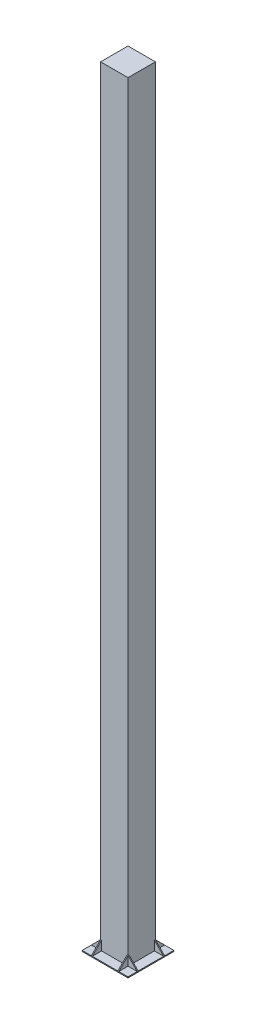
ISO-10303-21;
HEADER;
FILE_DESCRIPTION(('STEP AP214'),'2;1');
FILE_NAME('part.step','',(''),(''),'','','');
FILE_SCHEMA(('AUTOMOTIVE_DESIGN { 1 0 10303 214 1 1 1 1 }'));
ENDSEC;
DATA;
#1=APPLICATION_CONTEXT('core data for automotive mechanical design processes');
#2=APPLICATION_PROTOCOL_DEFINITION('international standard','automotive_design',2000,#1);
#3=PRODUCT_CONTEXT('',#1,'mechanical');
#4=PRODUCT('Part','Part','',(#3));
#5=PRODUCT_RELATED_PRODUCT_CATEGORY('part','',(#4));
#6=PRODUCT_DEFINITION_FORMATION('','',#4);
#7=PRODUCT_DEFINITION_CONTEXT('part definition',#1,'design');
#8=PRODUCT_DEFINITION('design','',#6,#7);
#9=PRODUCT_DEFINITION_SHAPE('','',#8);
#10=(LENGTH_UNIT() NAMED_UNIT(*) SI_UNIT(.MILLI.,.METRE.));
#11=(NAMED_UNIT(*) PLANE_ANGLE_UNIT() SI_UNIT($,.RADIAN.));
#12=(NAMED_UNIT(*) SI_UNIT($,.STERADIAN.) SOLID_ANGLE_UNIT());
#13=UNCERTAINTY_MEASURE_WITH_UNIT(LENGTH_MEASURE(1.E-05),#10,'distance_accuracy_value','');
#14=(GEOMETRIC_REPRESENTATION_CONTEXT(3) GLOBAL_UNCERTAINTY_ASSIGNED_CONTEXT((#13)) GLOBAL_UNIT_ASSIGNED_CONTEXT((#10,
#11,#12)) REPRESENTATION_CONTEXT('',''));
#15=CARTESIAN_POINT('',(0.,0.,0.));
#16=DIRECTION('',(0.,0.,1.));
#17=DIRECTION('',(1.,0.,0.));
#18=AXIS2_PLACEMENT_3D('',#15,#16,#17);
#19=CARTESIAN_POINT('',(0.,12.7,0.));
#20=DIRECTION('',(0.,1.,0.));
#21=DIRECTION('',(0.,0.,1.));
#22=AXIS2_PLACEMENT_3D('',#19,#20,#21);
#23=PLANE('',#22);
#24=DIRECTION('',(0.,0.,-1.));
#25=VECTOR('',#24,1.);
#26=CARTESIAN_POINT('',(-297.8,12.7,297.8));
#27=LINE('',#26,#25);
#28=CARTESIAN_POINT('',(-297.8,12.7,165.1));
#29=VERTEX_POINT('',#28);
#30=CARTESIAN_POINT('',(-297.8,12.7,-165.1));
#31=VERTEX_POINT('',#30);
#32=EDGE_CURVE('E223',#29,#31,#27,.T.);
#33=ORIENTED_EDGE('',*,*,#32,.F.);
#34=DIRECTION('',(1.,0.,0.));
#35=VECTOR('',#34,1.);
#36=CARTESIAN_POINT('',(-177.8,12.7,165.1));
#37=LINE('',#36,#35);
#38=CARTESIAN_POINT('',(-177.8,12.7,165.1));
#39=VERTEX_POINT('',#38);
#40=EDGE_CURVE('E213',#29,#39,#37,.T.);
#41=ORIENTED_EDGE('',*,*,#40,.T.);
#42=DIRECTION('',(0.,0.,1.));
#43=VECTOR('',#42,1.);
#44=CARTESIAN_POINT('',(-177.8,12.7000000000006,177.8));
#45=LINE('',#44,#43);
#46=CARTESIAN_POINT('',(-177.8,12.7,-165.1));
#47=VERTEX_POINT('',#46);
#48=EDGE_CURVE('E222',#47,#39,#45,.T.);
#49=ORIENTED_EDGE('',*,*,#48,.F.);
#50=DIRECTION('',(-1.,0.,0.));
#51=VECTOR('',#50,1.);
#52=CARTESIAN_POINT('',(-177.8,12.7,-165.1));
#53=LINE('',#52,#51);
#54=EDGE_CURVE('E415',#47,#31,#53,.T.);
#55=ORIENTED_EDGE('',*,*,#54,.T.);
#56=EDGE_LOOP('',(#33,#41,#49,#55));
#57=FACE_BOUND('',#56,.T.);
#58=ADVANCED_FACE('F37',(#57),#23,.T.);
#59=CARTESIAN_POINT('',(-177.8,10000.,177.8));
#60=DIRECTION('',(1.,0.,0.));
#61=DIRECTION('',(0.,0.,-1.));
#62=AXIS2_PLACEMENT_3D('',#59,#60,#61);
#63=PLANE('',#62);
#64=DIRECTION('',(0.,1.,0.));
#65=VECTOR('',#64,1.);
#66=CARTESIAN_POINT('',(-177.8,132.700000000008,165.1));
#67=LINE('',#66,#65);
#68=CARTESIAN_POINT('',(-177.8,132.700000000008,165.1));
#69=VERTEX_POINT('',#68);
#70=EDGE_CURVE('E210',#39,#69,#67,.T.);
#71=ORIENTED_EDGE('',*,*,#70,.T.);
#72=DIRECTION('',(0.,0.,1.));
#73=VECTOR('',#72,1.);
#74=CARTESIAN_POINT('',(-177.8,132.700000000008,165.1));
#75=LINE('',#74,#73);
#76=CARTESIAN_POINT('',(-177.8,132.700000000008,177.8));
#77=VERTEX_POINT('',#76);
#78=EDGE_CURVE('E413',#69,#77,#75,.T.);
#79=ORIENTED_EDGE('',*,*,#78,.T.);
#80=DIRECTION('',(0.,-1.,0.));
#81=VECTOR('',#80,1.);
#82=CARTESIAN_POINT('',(-177.8,10000.,177.8));
#83=LINE('',#82,#81);
#84=CARTESIAN_POINT('',(-177.8,10000.,177.8));
#85=VERTEX_POINT('',#84);
#86=EDGE_CURVE('E259',#85,#77,#83,.T.);
#87=ORIENTED_EDGE('',*,*,#86,.F.);
#88=DIRECTION('',(0.,0.,1.));
#89=VECTOR('',#88,1.);
#90=CARTESIAN_POINT('',(-177.8,10000.,177.8));
#91=LINE('',#90,#89);
#92=CARTESIAN_POINT('',(-177.8,10000.,-177.8));
#93=VERTEX_POINT('',#92);
#94=EDGE_CURVE('E252',#93,#85,#91,.T.);
#95=ORIENTED_EDGE('',*,*,#94,.F.);
#96=DIRECTION('',(0.,-1.,0.));
#97=VECTOR('',#96,1.);
#98=CARTESIAN_POINT('',(-177.8,10000.,-177.8));
#99=LINE('',#98,#97);
#100=CARTESIAN_POINT('',(-177.8,132.700000000008,-177.8));
#101=VERTEX_POINT('',#100);
#102=EDGE_CURVE('E262',#93,#101,#99,.T.);
#103=ORIENTED_EDGE('',*,*,#102,.T.);
#104=DIRECTION('',(0.,0.,-1.));
#105=VECTOR('',#104,1.);
#106=CARTESIAN_POINT('',(-177.8,132.700000000008,-165.1));
#107=LINE('',#106,#105);
#108=CARTESIAN_POINT('',(-177.8,132.700000000008,-165.1));
#109=VERTEX_POINT('',#108);
#110=EDGE_CURVE('E426',#109,#101,#107,.T.);
#111=ORIENTED_EDGE('',*,*,#110,.F.);
#112=DIRECTION('',(0.,-1.,0.));
#113=VECTOR('',#112,1.);
#114=CARTESIAN_POINT('',(-177.8,132.700000000008,-165.1));
#115=LINE('',#114,#113);
#116=EDGE_CURVE('E231',#109,#47,#115,.T.);
#117=ORIENTED_EDGE('',*,*,#116,.T.);
#118=ORIENTED_EDGE('',*,*,#48,.T.);
#119=EDGE_LOOP('',(#71,#79,#87,#95,#103,#111,#117,#118));
#120=FACE_BOUND('',#119,.T.);
#121=ADVANCED_FACE('F228',(#120),#63,.F.);
#122=CARTESIAN_POINT('',(-297.8,12.7,-177.8));
#123=VERTEX_POINT('',#122);
#124=CARTESIAN_POINT('',(-297.8,12.7,-297.8));
#125=VERTEX_POINT('',#124);
#126=EDGE_CURVE('E355',#123,#125,#27,.T.);
#127=ORIENTED_EDGE('',*,*,#126,.F.);
#128=DIRECTION('',(-1.,0.,0.));
#129=VECTOR('',#128,1.);
#130=CARTESIAN_POINT('',(-177.8,12.7,-177.8));
#131=LINE('',#130,#129);
#132=CARTESIAN_POINT('',(-177.8,12.7,-177.8));
#133=VERTEX_POINT('',#132);
#134=EDGE_CURVE('E60',#133,#123,#131,.T.);
#135=ORIENTED_EDGE('',*,*,#134,.F.);
#136=CARTESIAN_POINT('',(-177.8,12.7,-297.8));
#137=VERTEX_POINT('',#136);
#138=EDGE_CURVE('E232',#137,#133,#45,.T.);
#139=ORIENTED_EDGE('',*,*,#138,.F.);
#140=DIRECTION('',(1.,0.,0.));
#141=VECTOR('',#140,1.);
#142=CARTESIAN_POINT('',(297.8,12.7,-297.8));
#143=LINE('',#142,#141);
#144=EDGE_CURVE('E301',#125,#137,#143,.T.);
#145=ORIENTED_EDGE('',*,*,#144,.F.);
#146=EDGE_LOOP('',(#127,#135,#139,#145));
#147=FACE_BOUND('',#146,.T.);
#148=ADVANCED_FACE('F533',(#147),#23,.T.);
#149=DIRECTION('',(0.,-1.,0.));
#150=VECTOR('',#149,1.);
#151=CARTESIAN_POINT('',(-177.8,132.700000000008,-177.8));
#152=LINE('',#151,#150);
#153=EDGE_CURVE('E418',#101,#133,#152,.T.);
#154=ORIENTED_EDGE('',*,*,#153,.F.);
#155=DIRECTION('',(0.,-0.707106781186563,-0.707106781186532));
#156=VECTOR('',#155,1.);
#157=CARTESIAN_POINT('',(-177.8,12.7,-297.8));
#158=LINE('',#157,#156);
#159=EDGE_CURVE('E331',#101,#137,#158,.T.);
#160=ORIENTED_EDGE('',*,*,#159,.T.);
#161=ORIENTED_EDGE('',*,*,#138,.T.);
#162=EDGE_LOOP('',(#154,#160,#161));
#163=FACE_BOUND('',#162,.T.);
#164=ADVANCED_FACE('F539',(#163),#63,.F.);
#165=DIRECTION('',(1.,0.,0.));
#166=VECTOR('',#165,1.);
#167=CARTESIAN_POINT('',(-177.8,12.7000000000006,177.8));
#168=LINE('',#167,#166);
#169=CARTESIAN_POINT('',(177.8,12.7,177.8));
#170=VERTEX_POINT('',#169);
#171=CARTESIAN_POINT('',(297.8,12.7,177.8));
#172=VERTEX_POINT('',#171);
#173=EDGE_CURVE('E45',#170,#172,#168,.T.);
#174=ORIENTED_EDGE('',*,*,#173,.F.);
#175=DIRECTION('',(0.,0.,-1.));
#176=VECTOR('',#175,1.);
#177=CARTESIAN_POINT('',(177.8,12.7,297.8));
#178=LINE('',#177,#176);
#179=CARTESIAN_POINT('',(177.8,12.7,297.8));
#180=VERTEX_POINT('',#179);
#181=EDGE_CURVE('E433',#180,#170,#178,.T.);
#182=ORIENTED_EDGE('',*,*,#181,.F.);
#183=DIRECTION('',(-1.,0.,0.));
#184=VECTOR('',#183,1.);
#185=CARTESIAN_POINT('',(297.8,12.7,297.8));
#186=LINE('',#185,#184);
#187=CARTESIAN_POINT('',(297.8,12.7,297.8));
#188=VERTEX_POINT('',#187);
#189=EDGE_CURVE('E297',#188,#180,#186,.T.);
#190=ORIENTED_EDGE('',*,*,#189,.F.);
#191=DIRECTION('',(0.,0.,1.));
#192=VECTOR('',#191,1.);
#193=CARTESIAN_POINT('',(297.8,12.7,297.8));
#194=LINE('',#193,#192);
#195=EDGE_CURVE('E294',#172,#188,#194,.T.);
#196=ORIENTED_EDGE('',*,*,#195,.F.);
#197=EDGE_LOOP('',(#174,#182,#190,#196));
#198=FACE_BOUND('',#197,.T.);
#199=ADVANCED_FACE('F295',(#198),#23,.T.);
#200=CARTESIAN_POINT('',(-177.8,10000.,177.8));
#201=DIRECTION('',(0.,0.,-1.));
#202=DIRECTION('',(-1.,0.,0.));
#203=AXIS2_PLACEMENT_3D('',#200,#201,#202);
#204=PLANE('',#203);
#205=DIRECTION('',(0.,1.,0.));
#206=VECTOR('',#205,1.);
#207=CARTESIAN_POINT('',(177.8,12.7,177.8));
#208=LINE('',#207,#206);
#209=CARTESIAN_POINT('',(177.8,132.700000000008,177.8));
#210=VERTEX_POINT('',#209);
#211=EDGE_CURVE('E277',#170,#210,#208,.T.);
#212=ORIENTED_EDGE('',*,*,#211,.F.);
#213=ORIENTED_EDGE('',*,*,#173,.T.);
#214=DIRECTION('',(-0.707106781186522,0.707106781186573,0.));
#215=VECTOR('',#214,1.);
#216=CARTESIAN_POINT('',(297.8,12.7,177.8));
#217=LINE('',#216,#215);
#218=EDGE_CURVE('E275',#172,#210,#217,.T.);
#219=ORIENTED_EDGE('',*,*,#218,.T.);
#220=EDGE_LOOP('',(#212,#213,#219));
#221=FACE_BOUND('',#220,.T.);
#222=ADVANCED_FACE('F274',(#221),#204,.F.);
#223=DIRECTION('',(1.,0.,0.));
#224=VECTOR('',#223,1.);
#225=CARTESIAN_POINT('',(-177.8,12.7,177.8));
#226=LINE('',#225,#224);
#227=CARTESIAN_POINT('',(-297.8,12.7,177.8));
#228=VERTEX_POINT('',#227);
#229=CARTESIAN_POINT('',(-177.8,12.7,177.8));
#230=VERTEX_POINT('',#229);
#231=EDGE_CURVE('E401',#228,#230,#226,.T.);
#232=ORIENTED_EDGE('',*,*,#231,.F.);
#233=CARTESIAN_POINT('',(-297.8,12.7,297.8));
#234=VERTEX_POINT('',#233);
#235=EDGE_CURVE('E351',#234,#228,#27,.T.);
#236=ORIENTED_EDGE('',*,*,#235,.F.);
#237=CARTESIAN_POINT('',(-177.8,12.7,297.8));
#238=VERTEX_POINT('',#237);
#239=EDGE_CURVE('E360',#238,#234,#186,.T.);
#240=ORIENTED_EDGE('',*,*,#239,.F.);
#241=EDGE_CURVE('E233',#230,#238,#45,.T.);
#242=ORIENTED_EDGE('',*,*,#241,.F.);
#243=EDGE_LOOP('',(#232,#236,#240,#242));
#244=FACE_BOUND('',#243,.T.);
#245=ADVANCED_FACE('F399',(#244),#23,.T.);
#246=DIRECTION('',(0.,0.,-1.));
#247=VECTOR('',#246,1.);
#248=CARTESIAN_POINT('',(177.8,12.7000000000006,177.8));
#249=LINE('',#248,#247);
#250=CARTESIAN_POINT('',(177.8,12.7000000000006,-177.8));
#251=VERTEX_POINT('',#250);
#252=CARTESIAN_POINT('',(177.8,12.7,-297.8));
#253=VERTEX_POINT('',#252);
#254=EDGE_CURVE('E243',#251,#253,#249,.T.);
#255=ORIENTED_EDGE('',*,*,#254,.F.);
#256=DIRECTION('',(-1.,0.,0.));
#257=VECTOR('',#256,1.);
#258=CARTESIAN_POINT('',(297.8,12.7,-177.8));
#259=LINE('',#258,#257);
#260=CARTESIAN_POINT('',(297.8,12.7,-177.8));
#261=VERTEX_POINT('',#260);
#262=EDGE_CURVE('E470',#261,#251,#259,.T.);
#263=ORIENTED_EDGE('',*,*,#262,.F.);
#264=CARTESIAN_POINT('',(297.8,12.7,-297.8));
#265=VERTEX_POINT('',#264);
#266=EDGE_CURVE('E303',#265,#261,#194,.T.);
#267=ORIENTED_EDGE('',*,*,#266,.F.);
#268=EDGE_CURVE('E354',#253,#265,#143,.T.);
#269=ORIENTED_EDGE('',*,*,#268,.F.);
#270=EDGE_LOOP('',(#255,#263,#267,#269));
#271=FACE_BOUND('',#270,.T.);
#272=ADVANCED_FACE('F569',(#271),#23,.T.);
#273=CARTESIAN_POINT('',(177.8,10000.,177.8));
#274=DIRECTION('',(-1.,0.,0.));
#275=DIRECTION('',(0.,0.,1.));
#276=AXIS2_PLACEMENT_3D('',#273,#274,#275);
#277=PLANE('',#276);
#278=DIRECTION('',(0.,1.,0.));
#279=VECTOR('',#278,1.);
#280=CARTESIAN_POINT('',(177.8,12.7000000000006,-177.8));
#281=LINE('',#280,#279);
#282=CARTESIAN_POINT('',(177.8,132.700000000008,-177.8));
#283=VERTEX_POINT('',#282);
#284=EDGE_CURVE('E464',#251,#283,#281,.T.);
#285=ORIENTED_EDGE('',*,*,#284,.F.);
#286=ORIENTED_EDGE('',*,*,#254,.T.);
#287=DIRECTION('',(0.,0.707106781186564,0.707106781186531));
#288=VECTOR('',#287,1.);
#289=CARTESIAN_POINT('',(177.8,132.700000000008,-177.799999999997));
#290=LINE('',#289,#288);
#291=EDGE_CURVE('E310',#253,#283,#290,.T.);
#292=ORIENTED_EDGE('',*,*,#291,.T.);
#293=EDGE_LOOP('',(#285,#286,#292));
#294=FACE_BOUND('',#293,.T.);
#295=ADVANCED_FACE('F553',(#294),#277,.F.);
#296=DIRECTION('',(0.,0.,-1.));
#297=VECTOR('',#296,1.);
#298=CARTESIAN_POINT('',(165.1,12.7,297.8));
#299=LINE('',#298,#297);
#300=CARTESIAN_POINT('',(165.1,12.7,297.8));
#301=VERTEX_POINT('',#300);
#302=CARTESIAN_POINT('',(165.1,12.7,177.8));
#303=VERTEX_POINT('',#302);
#304=EDGE_CURVE('E436',#301,#303,#299,.T.);
#305=ORIENTED_EDGE('',*,*,#304,.T.);
#306=CARTESIAN_POINT('',(-165.1,12.7000000000006,177.8));
#307=VERTEX_POINT('',#306);
#308=EDGE_CURVE('E11',#307,#303,#168,.T.);
#309=ORIENTED_EDGE('',*,*,#308,.F.);
#310=DIRECTION('',(0.,0.,1.));
#311=VECTOR('',#310,1.);
#312=CARTESIAN_POINT('',(-165.1,12.7000000000006,177.8));
#313=LINE('',#312,#311);
#314=CARTESIAN_POINT('',(-165.1,12.7,297.8));
#315=VERTEX_POINT('',#314);
#316=EDGE_CURVE('E450',#307,#315,#313,.T.);
#317=ORIENTED_EDGE('',*,*,#316,.T.);
#318=EDGE_CURVE('E362',#301,#315,#186,.T.);
#319=ORIENTED_EDGE('',*,*,#318,.F.);
#320=EDGE_LOOP('',(#305,#309,#317,#319));
#321=FACE_BOUND('',#320,.T.);
#322=ADVANCED_FACE('F506',(#321),#23,.T.);
#323=DIRECTION('',(-1.,0.,0.));
#324=VECTOR('',#323,1.);
#325=CARTESIAN_POINT('',(-177.8,12.7000000000006,-177.8));
#326=LINE('',#325,#324);
#327=CARTESIAN_POINT('',(165.1,12.7000000000006,-177.8));
#328=VERTEX_POINT('',#327);
#329=CARTESIAN_POINT('',(-165.1,12.7000000000006,-177.8));
#330=VERTEX_POINT('',#329);
#331=EDGE_CURVE('E236',#328,#330,#326,.T.);
#332=ORIENTED_EDGE('',*,*,#331,.F.);
#333=DIRECTION('',(0.,0.,-1.));
#334=VECTOR('',#333,1.);
#335=CARTESIAN_POINT('',(165.1,12.7,-297.8));
#336=LINE('',#335,#334);
#337=CARTESIAN_POINT('',(165.1,12.7,-297.8));
#338=VERTEX_POINT('',#337);
#339=EDGE_CURVE('E319',#328,#338,#336,.T.);
#340=ORIENTED_EDGE('',*,*,#339,.T.);
#341=CARTESIAN_POINT('',(-165.1,12.7,-297.8));
#342=VERTEX_POINT('',#341);
#343=EDGE_CURVE('E357',#342,#338,#143,.T.);
#344=ORIENTED_EDGE('',*,*,#343,.F.);
#345=DIRECTION('',(0.,0.,1.));
#346=VECTOR('',#345,1.);
#347=CARTESIAN_POINT('',(-165.1,12.7000000000006,-177.8));
#348=LINE('',#347,#346);
#349=EDGE_CURVE('E334',#342,#330,#348,.T.);
#350=ORIENTED_EDGE('',*,*,#349,.T.);
#351=EDGE_LOOP('',(#332,#340,#344,#350));
#352=FACE_BOUND('',#351,.T.);
#353=ADVANCED_FACE('F546',(#352),#23,.T.);
#354=DIRECTION('',(-1.,0.,0.));
#355=VECTOR('',#354,1.);
#356=CARTESIAN_POINT('',(297.8,12.7,-165.1));
#357=LINE('',#356,#355);
#358=CARTESIAN_POINT('',(297.8,12.7,-165.1));
#359=VERTEX_POINT('',#358);
#360=CARTESIAN_POINT('',(177.8,12.7000000000006,-165.1));
#361=VERTEX_POINT('',#360);
#362=EDGE_CURVE('E473',#359,#361,#357,.T.);
#363=ORIENTED_EDGE('',*,*,#362,.T.);
#364=CARTESIAN_POINT('',(177.8,12.7000000000006,165.1));
#365=VERTEX_POINT('',#364);
#366=EDGE_CURVE('E244',#365,#361,#249,.T.);
#367=ORIENTED_EDGE('',*,*,#366,.F.);
#368=DIRECTION('',(1.,0.,0.));
#369=VECTOR('',#368,1.);
#370=CARTESIAN_POINT('',(177.8,12.7000000000006,165.1));
#371=LINE('',#370,#369);
#372=CARTESIAN_POINT('',(297.8,12.7,165.1));
#373=VERTEX_POINT('',#372);
#374=EDGE_CURVE('E290',#365,#373,#371,.T.);
#375=ORIENTED_EDGE('',*,*,#374,.T.);
#376=EDGE_CURVE('E300',#359,#373,#194,.T.);
#377=ORIENTED_EDGE('',*,*,#376,.F.);
#378=EDGE_LOOP('',(#363,#367,#375,#377));
#379=FACE_BOUND('',#378,.T.);
#380=ADVANCED_FACE('F534',(#379),#23,.T.);
#381=ORIENTED_EDGE('',*,*,#366,.T.);
#382=DIRECTION('',(0.,1.,0.));
#383=VECTOR('',#382,1.);
#384=CARTESIAN_POINT('',(177.8,12.7000000000006,-165.1));
#385=LINE('',#384,#383);
#386=CARTESIAN_POINT('',(177.8,132.700000000008,-165.1));
#387=VERTEX_POINT('',#386);
#388=EDGE_CURVE('E466',#361,#387,#385,.T.);
#389=ORIENTED_EDGE('',*,*,#388,.T.);
#390=DIRECTION('',(0.,0.,-1.));
#391=VECTOR('',#390,1.);
#392=CARTESIAN_POINT('',(177.8,132.700000000008,-165.1));
#393=LINE('',#392,#391);
#394=EDGE_CURVE('E476',#387,#283,#393,.T.);
#395=ORIENTED_EDGE('',*,*,#394,.T.);
#396=DIRECTION('',(0.,-1.,0.));
#397=VECTOR('',#396,1.);
#398=CARTESIAN_POINT('',(177.8,10000.,-177.8));
#399=LINE('',#398,#397);
#400=CARTESIAN_POINT('',(177.8,10000.,-177.8));
#401=VERTEX_POINT('',#400);
#402=EDGE_CURVE('E264',#401,#283,#399,.T.);
#403=ORIENTED_EDGE('',*,*,#402,.F.);
#404=DIRECTION('',(0.,0.,-1.));
#405=VECTOR('',#404,1.);
#406=CARTESIAN_POINT('',(177.8,10000.,177.8));
#407=LINE('',#406,#405);
#408=CARTESIAN_POINT('',(177.8,10000.,177.8));
#409=VERTEX_POINT('',#408);
#410=EDGE_CURVE('E247',#409,#401,#407,.T.);
#411=ORIENTED_EDGE('',*,*,#410,.F.);
#412=DIRECTION('',(0.,-1.,0.));
#413=VECTOR('',#412,1.);
#414=CARTESIAN_POINT('',(177.8,10000.,177.8));
#415=LINE('',#414,#413);
#416=EDGE_CURVE('E256',#409,#210,#415,.T.);
#417=ORIENTED_EDGE('',*,*,#416,.T.);
#418=DIRECTION('',(0.,0.,1.));
#419=VECTOR('',#418,1.);
#420=CARTESIAN_POINT('',(177.8,132.700000000008,165.1));
#421=LINE('',#420,#419);
#422=CARTESIAN_POINT('',(177.8,132.700000000008,165.1));
#423=VERTEX_POINT('',#422);
#424=EDGE_CURVE('E289',#423,#210,#421,.T.);
#425=ORIENTED_EDGE('',*,*,#424,.F.);
#426=DIRECTION('',(0.,-1.,0.));
#427=VECTOR('',#426,1.);
#428=CARTESIAN_POINT('',(177.8,132.700000000008,165.1));
#429=LINE('',#428,#427);
#430=EDGE_CURVE('E308',#423,#365,#429,.T.);
#431=ORIENTED_EDGE('',*,*,#430,.T.);
#432=EDGE_LOOP('',(#381,#389,#395,#403,#411,#417,#425,#431));
#433=FACE_BOUND('',#432,.T.);
#434=ADVANCED_FACE('F39',(#433),#277,.F.);
#435=CARTESIAN_POINT('',(-177.8,10000.,-177.8));
#436=DIRECTION('',(0.,0.,1.));
#437=DIRECTION('',(1.,0.,0.));
#438=AXIS2_PLACEMENT_3D('',#435,#436,#437);
#439=PLANE('',#438);
#440=ORIENTED_EDGE('',*,*,#402,.T.);
#441=DIRECTION('',(1.,0.,0.));
#442=VECTOR('',#441,1.);
#443=CARTESIAN_POINT('',(165.1,132.700000000008,-177.799999999997));
#444=LINE('',#443,#442);
#445=CARTESIAN_POINT('',(165.1,132.700000000008,-177.799999999997));
#446=VERTEX_POINT('',#445);
#447=EDGE_CURVE('E328',#446,#283,#444,.T.);
#448=ORIENTED_EDGE('',*,*,#447,.F.);
#449=DIRECTION('',(0.,-1.,0.));
#450=VECTOR('',#449,1.);
#451=CARTESIAN_POINT('',(165.1,12.7000000000006,-177.8));
#452=LINE('',#451,#450);
#453=EDGE_CURVE('E316',#446,#328,#452,.T.);
#454=ORIENTED_EDGE('',*,*,#453,.T.);
#455=ORIENTED_EDGE('',*,*,#331,.T.);
#456=DIRECTION('',(0.,1.,0.));
#457=VECTOR('',#456,1.);
#458=CARTESIAN_POINT('',(-165.1,132.700000000008,-177.799999999997));
#459=LINE('',#458,#457);
#460=CARTESIAN_POINT('',(-165.1,132.700000000008,-177.799999999997));
#461=VERTEX_POINT('',#460);
#462=EDGE_CURVE('E337',#330,#461,#459,.T.);
#463=ORIENTED_EDGE('',*,*,#462,.T.);
#464=DIRECTION('',(-1.,0.,0.));
#465=VECTOR('',#464,1.);
#466=CARTESIAN_POINT('',(-165.1,132.700000000008,-177.799999999997));
#467=LINE('',#466,#465);
#468=EDGE_CURVE('E342',#461,#101,#467,.T.);
#469=ORIENTED_EDGE('',*,*,#468,.T.);
#470=ORIENTED_EDGE('',*,*,#102,.F.);
#471=DIRECTION('',(-1.,0.,0.));
#472=VECTOR('',#471,1.);
#473=CARTESIAN_POINT('',(-177.8,10000.,-177.8));
#474=LINE('',#473,#472);
#475=EDGE_CURVE('E250',#401,#93,#474,.T.);
#476=ORIENTED_EDGE('',*,*,#475,.F.);
#477=EDGE_LOOP('',(#440,#448,#454,#455,#463,#469,#470,#476));
#478=FACE_BOUND('',#477,.T.);
#479=ADVANCED_FACE('F552',(#478),#439,.F.);
#480=DIRECTION('',(0.,0.707106781186572,-0.707106781186523));
#481=VECTOR('',#480,1.);
#482=CARTESIAN_POINT('',(-177.8,12.7,297.8));
#483=LINE('',#482,#481);
#484=EDGE_CURVE('E447',#238,#77,#483,.T.);
#485=ORIENTED_EDGE('',*,*,#484,.T.);
#486=DIRECTION('',(0.,1.,0.));
#487=VECTOR('',#486,1.);
#488=CARTESIAN_POINT('',(-177.8,132.700000000008,177.8));
#489=LINE('',#488,#487);
#490=EDGE_CURVE('E405',#230,#77,#489,.T.);
#491=ORIENTED_EDGE('',*,*,#490,.F.);
#492=ORIENTED_EDGE('',*,*,#241,.T.);
#493=EDGE_LOOP('',(#485,#491,#492));
#494=FACE_BOUND('',#493,.T.);
#495=ADVANCED_FACE('F540',(#494),#63,.F.);
#496=ORIENTED_EDGE('',*,*,#308,.T.);
#497=DIRECTION('',(0.,1.,0.));
#498=VECTOR('',#497,1.);
#499=CARTESIAN_POINT('',(165.1,12.7,177.8));
#500=LINE('',#499,#498);
#501=CARTESIAN_POINT('',(165.1,132.700000000008,177.8));
#502=VERTEX_POINT('',#501);
#503=EDGE_CURVE('E429',#303,#502,#500,.T.);
#504=ORIENTED_EDGE('',*,*,#503,.T.);
#505=DIRECTION('',(1.,0.,0.));
#506=VECTOR('',#505,1.);
#507=CARTESIAN_POINT('',(165.1,132.700000000008,177.8));
#508=LINE('',#507,#506);
#509=EDGE_CURVE('E439',#502,#210,#508,.T.);
#510=ORIENTED_EDGE('',*,*,#509,.T.);
#511=ORIENTED_EDGE('',*,*,#416,.F.);
#512=DIRECTION('',(1.,0.,0.));
#513=VECTOR('',#512,1.);
#514=CARTESIAN_POINT('',(-177.8,10000.,177.8));
#515=LINE('',#514,#513);
#516=EDGE_CURVE('E254',#85,#409,#515,.T.);
#517=ORIENTED_EDGE('',*,*,#516,.F.);
#518=ORIENTED_EDGE('',*,*,#86,.T.);
#519=DIRECTION('',(-1.,0.,0.));
#520=VECTOR('',#519,1.);
#521=CARTESIAN_POINT('',(-165.1,132.700000000008,177.8));
#522=LINE('',#521,#520);
#523=CARTESIAN_POINT('',(-165.1,132.700000000008,177.8));
#524=VERTEX_POINT('',#523);
#525=EDGE_CURVE('E461',#524,#77,#522,.T.);
#526=ORIENTED_EDGE('',*,*,#525,.F.);
#527=DIRECTION('',(0.,-1.,0.));
#528=VECTOR('',#527,1.);
#529=CARTESIAN_POINT('',(-165.1,132.700000000008,177.8));
#530=LINE('',#529,#528);
#531=EDGE_CURVE('E455',#524,#307,#530,.T.);
#532=ORIENTED_EDGE('',*,*,#531,.T.);
#533=EDGE_LOOP('',(#496,#504,#510,#511,#517,#518,#526,#532));
#534=FACE_BOUND('',#533,.T.);
#535=ADVANCED_FACE('F497',(#534),#204,.F.);
#536=CARTESIAN_POINT('',(0.,10000.,0.));
#537=DIRECTION('',(0.,-1.,0.));
#538=DIRECTION('',(0.,0.,-1.));
#539=AXIS2_PLACEMENT_3D('',#536,#537,#538);
#540=PLANE('',#539);
#541=ORIENTED_EDGE('',*,*,#410,.T.);
#542=ORIENTED_EDGE('',*,*,#475,.T.);
#543=ORIENTED_EDGE('',*,*,#94,.T.);
#544=ORIENTED_EDGE('',*,*,#516,.T.);
#545=EDGE_LOOP('',(#541,#542,#543,#544));
#546=FACE_BOUND('',#545,.T.);
#547=ADVANCED_FACE('F592',(#546),#540,.F.);
#548=CARTESIAN_POINT('',(-297.8,12.7,297.8));
#549=DIRECTION('',(-1.,0.,0.));
#550=DIRECTION('',(0.,0.,1.));
#551=AXIS2_PLACEMENT_3D('',#548,#549,#550);
#552=PLANE('',#551);
#553=DIRECTION('',(0.,0.,-1.));
#554=VECTOR('',#553,1.);
#555=CARTESIAN_POINT('',(-297.8,0.,297.8));
#556=LINE('',#555,#554);
#557=CARTESIAN_POINT('',(-297.8,0.,297.8));
#558=VERTEX_POINT('',#557);
#559=CARTESIAN_POINT('',(-297.8,0.,-297.8));
#560=VERTEX_POINT('',#559);
#561=EDGE_CURVE('E348',#558,#560,#556,.T.);
#562=ORIENTED_EDGE('',*,*,#561,.F.);
#563=DIRECTION('',(0.,-1.,0.));
#564=VECTOR('',#563,1.);
#565=CARTESIAN_POINT('',(-297.8,12.7,297.8));
#566=LINE('',#565,#564);
#567=EDGE_CURVE('E237',#234,#558,#566,.T.);
#568=ORIENTED_EDGE('',*,*,#567,.F.);
#569=ORIENTED_EDGE('',*,*,#235,.T.);
#570=DIRECTION('',(0.,0.,1.));
#571=VECTOR('',#570,1.);
#572=CARTESIAN_POINT('',(-297.8,12.7,165.1));
#573=LINE('',#572,#571);
#574=EDGE_CURVE('E411',#29,#228,#573,.T.);
#575=ORIENTED_EDGE('',*,*,#574,.F.);
#576=ORIENTED_EDGE('',*,*,#32,.T.);
#577=DIRECTION('',(0.,0.,-1.));
#578=VECTOR('',#577,1.);
#579=CARTESIAN_POINT('',(-297.8,12.7,-165.1));
#580=LINE('',#579,#578);
#581=EDGE_CURVE('E421',#31,#123,#580,.T.);
#582=ORIENTED_EDGE('',*,*,#581,.T.);
#583=ORIENTED_EDGE('',*,*,#126,.T.);
#584=DIRECTION('',(0.,-1.,0.));
#585=VECTOR('',#584,1.);
#586=CARTESIAN_POINT('',(-297.8,12.7,-297.8));
#587=LINE('',#586,#585);
#588=EDGE_CURVE('E240',#125,#560,#587,.T.);
#589=ORIENTED_EDGE('',*,*,#588,.T.);
#590=EDGE_LOOP('',(#562,#568,#569,#575,#576,#582,#583,#589));
#591=FACE_BOUND('',#590,.T.);
#592=ADVANCED_FACE('F383',(#591),#552,.T.);
#593=CARTESIAN_POINT('',(297.8,12.7,297.8));
#594=DIRECTION('',(0.,0.,1.));
#595=DIRECTION('',(1.,0.,0.));
#596=AXIS2_PLACEMENT_3D('',#593,#594,#595);
#597=PLANE('',#596);
#598=DIRECTION('',(-1.,0.,0.));
#599=VECTOR('',#598,1.);
#600=CARTESIAN_POINT('',(297.8,0.,297.8));
#601=LINE('',#600,#599);
#602=CARTESIAN_POINT('',(297.8,0.,297.8));
#603=VERTEX_POINT('',#602);
#604=EDGE_CURVE('E371',#603,#558,#601,.T.);
#605=ORIENTED_EDGE('',*,*,#604,.F.);
#606=DIRECTION('',(0.,-1.,0.));
#607=VECTOR('',#606,1.);
#608=CARTESIAN_POINT('',(297.8,12.7,297.8));
#609=LINE('',#608,#607);
#610=EDGE_CURVE('E375',#188,#603,#609,.T.);
#611=ORIENTED_EDGE('',*,*,#610,.F.);
#612=ORIENTED_EDGE('',*,*,#189,.T.);
#613=DIRECTION('',(1.,0.,0.));
#614=VECTOR('',#613,1.);
#615=CARTESIAN_POINT('',(165.1,12.7,297.8));
#616=LINE('',#615,#614);
#617=EDGE_CURVE('E445',#301,#180,#616,.T.);
#618=ORIENTED_EDGE('',*,*,#617,.F.);
#619=ORIENTED_EDGE('',*,*,#318,.T.);
#620=DIRECTION('',(-1.,0.,0.));
#621=VECTOR('',#620,1.);
#622=CARTESIAN_POINT('',(-165.1,12.7,297.8));
#623=LINE('',#622,#621);
#624=EDGE_CURVE('E458',#315,#238,#623,.T.);
#625=ORIENTED_EDGE('',*,*,#624,.T.);
#626=ORIENTED_EDGE('',*,*,#239,.T.);
#627=ORIENTED_EDGE('',*,*,#567,.T.);
#628=EDGE_LOOP('',(#605,#611,#612,#618,#619,#625,#626,#627));
#629=FACE_BOUND('',#628,.T.);
#630=ADVANCED_FACE('F393',(#629),#597,.T.);
#631=CARTESIAN_POINT('',(297.8,12.7,297.8));
#632=DIRECTION('',(1.,0.,0.));
#633=DIRECTION('',(0.,0.,-1.));
#634=AXIS2_PLACEMENT_3D('',#631,#632,#633);
#635=PLANE('',#634);
#636=DIRECTION('',(0.,0.,1.));
#637=VECTOR('',#636,1.);
#638=CARTESIAN_POINT('',(297.8,0.,297.8));
#639=LINE('',#638,#637);
#640=CARTESIAN_POINT('',(297.8,0.,-297.8));
#641=VERTEX_POINT('',#640);
#642=EDGE_CURVE('E368',#641,#603,#639,.T.);
#643=ORIENTED_EDGE('',*,*,#642,.F.);
#644=DIRECTION('',(0.,-1.,0.));
#645=VECTOR('',#644,1.);
#646=CARTESIAN_POINT('',(297.8,12.7,-297.8));
#647=LINE('',#646,#645);
#648=EDGE_CURVE('E376',#265,#641,#647,.T.);
#649=ORIENTED_EDGE('',*,*,#648,.F.);
#650=ORIENTED_EDGE('',*,*,#266,.T.);
#651=DIRECTION('',(0.,0.,-1.));
#652=VECTOR('',#651,1.);
#653=CARTESIAN_POINT('',(297.8,12.7,-165.1));
#654=LINE('',#653,#652);
#655=EDGE_CURVE('E291',#359,#261,#654,.T.);
#656=ORIENTED_EDGE('',*,*,#655,.F.);
#657=ORIENTED_EDGE('',*,*,#376,.T.);
#658=DIRECTION('',(0.,0.,1.));
#659=VECTOR('',#658,1.);
#660=CARTESIAN_POINT('',(297.8,12.7,165.1));
#661=LINE('',#660,#659);
#662=EDGE_CURVE('E286',#373,#172,#661,.T.);
#663=ORIENTED_EDGE('',*,*,#662,.T.);
#664=ORIENTED_EDGE('',*,*,#195,.T.);
#665=ORIENTED_EDGE('',*,*,#610,.T.);
#666=EDGE_LOOP('',(#643,#649,#650,#656,#657,#663,#664,#665));
#667=FACE_BOUND('',#666,.T.);
#668=ADVANCED_FACE('F305',(#667),#635,.T.);
#669=CARTESIAN_POINT('',(297.8,12.7,-297.8));
#670=DIRECTION('',(0.,0.,-1.));
#671=DIRECTION('',(-1.,0.,0.));
#672=AXIS2_PLACEMENT_3D('',#669,#670,#671);
#673=PLANE('',#672);
#674=DIRECTION('',(1.,0.,0.));
#675=VECTOR('',#674,1.);
#676=CARTESIAN_POINT('',(297.8,0.,-297.8));
#677=LINE('',#676,#675);
#678=EDGE_CURVE('E365',#560,#641,#677,.T.);
#679=ORIENTED_EDGE('',*,*,#678,.F.);
#680=ORIENTED_EDGE('',*,*,#588,.F.);
#681=ORIENTED_EDGE('',*,*,#144,.T.);
#682=DIRECTION('',(-1.,0.,0.));
#683=VECTOR('',#682,1.);
#684=CARTESIAN_POINT('',(-165.1,12.7,-297.8));
#685=LINE('',#684,#683);
#686=EDGE_CURVE('E345',#342,#137,#685,.T.);
#687=ORIENTED_EDGE('',*,*,#686,.F.);
#688=ORIENTED_EDGE('',*,*,#343,.T.);
#689=DIRECTION('',(1.,0.,0.));
#690=VECTOR('',#689,1.);
#691=CARTESIAN_POINT('',(165.1,12.7,-297.8));
#692=LINE('',#691,#690);
#693=EDGE_CURVE('E325',#338,#253,#692,.T.);
#694=ORIENTED_EDGE('',*,*,#693,.T.);
#695=ORIENTED_EDGE('',*,*,#268,.T.);
#696=ORIENTED_EDGE('',*,*,#648,.T.);
#697=EDGE_LOOP('',(#679,#680,#681,#687,#688,#694,#695,#696));
#698=FACE_BOUND('',#697,.T.);
#699=ADVANCED_FACE('F388',(#698),#673,.T.);
#700=CARTESIAN_POINT('',(0.,0.,0.));
#701=DIRECTION('',(0.,-1.,0.));
#702=DIRECTION('',(0.,0.,-1.));
#703=AXIS2_PLACEMENT_3D('',#700,#701,#702);
#704=PLANE('',#703);
#705=ORIENTED_EDGE('',*,*,#561,.T.);
#706=ORIENTED_EDGE('',*,*,#678,.T.);
#707=ORIENTED_EDGE('',*,*,#642,.T.);
#708=ORIENTED_EDGE('',*,*,#604,.T.);
#709=EDGE_LOOP('',(#705,#706,#707,#708));
#710=FACE_BOUND('',#709,.T.);
#711=ADVANCED_FACE('F390',(#710),#704,.T.);
#712=CARTESIAN_POINT('',(-165.1,12.7,-297.8));
#713=DIRECTION('',(0.,0.707106781186532,-0.707106781186563));
#714=DIRECTION('',(0.,0.707106781186563,0.707106781186532));
#715=AXIS2_PLACEMENT_3D('',#712,#713,#714);
#716=PLANE('',#715);
#717=ORIENTED_EDGE('',*,*,#159,.F.);
#718=ORIENTED_EDGE('',*,*,#468,.F.);
#719=DIRECTION('',(0.,-0.707106781186563,-0.707106781186532));
#720=VECTOR('',#719,1.);
#721=CARTESIAN_POINT('',(-165.1,12.7,-297.8));
#722=LINE('',#721,#720);
#723=EDGE_CURVE('E340',#461,#342,#722,.T.);
#724=ORIENTED_EDGE('',*,*,#723,.T.);
#725=ORIENTED_EDGE('',*,*,#686,.T.);
#726=EDGE_LOOP('',(#717,#718,#724,#725));
#727=FACE_BOUND('',#726,.T.);
#728=ADVANCED_FACE('F587',(#727),#716,.T.);
#729=CARTESIAN_POINT('',(-165.1,0.,0.));
#730=DIRECTION('',(-1.,0.,0.));
#731=DIRECTION('',(0.,0.,1.));
#732=AXIS2_PLACEMENT_3D('',#729,#730,#731);
#733=PLANE('',#732);
#734=ORIENTED_EDGE('',*,*,#349,.F.);
#735=ORIENTED_EDGE('',*,*,#723,.F.);
#736=ORIENTED_EDGE('',*,*,#462,.F.);
#737=EDGE_LOOP('',(#734,#735,#736));
#738=FACE_BOUND('',#737,.T.);
#739=ADVANCED_FACE('F584',(#738),#733,.F.);
#740=CARTESIAN_POINT('',(165.1,132.700000000008,-177.799999999997));
#741=DIRECTION('',(0.,0.707106781186531,-0.707106781186564));
#742=DIRECTION('',(0.,0.707106781186564,0.707106781186531));
#743=AXIS2_PLACEMENT_3D('',#740,#741,#742);
#744=PLANE('',#743);
#745=ORIENTED_EDGE('',*,*,#291,.F.);
#746=ORIENTED_EDGE('',*,*,#693,.F.);
#747=DIRECTION('',(0.,0.707106781186564,0.707106781186531));
#748=VECTOR('',#747,1.);
#749=CARTESIAN_POINT('',(165.1,132.700000000008,-177.799999999997));
#750=LINE('',#749,#748);
#751=EDGE_CURVE('E322',#338,#446,#750,.T.);
#752=ORIENTED_EDGE('',*,*,#751,.T.);
#753=ORIENTED_EDGE('',*,*,#447,.T.);
#754=EDGE_LOOP('',(#745,#746,#752,#753));
#755=FACE_BOUND('',#754,.T.);
#756=ADVANCED_FACE('F576',(#755),#744,.T.);
#757=CARTESIAN_POINT('',(165.1,0.,0.));
#758=DIRECTION('',(1.,0.,0.));
#759=DIRECTION('',(0.,0.,-1.));
#760=AXIS2_PLACEMENT_3D('',#757,#758,#759);
#761=PLANE('',#760);
#762=ORIENTED_EDGE('',*,*,#453,.F.);
#763=ORIENTED_EDGE('',*,*,#751,.F.);
#764=ORIENTED_EDGE('',*,*,#339,.F.);
#765=EDGE_LOOP('',(#762,#763,#764));
#766=FACE_BOUND('',#765,.T.);
#767=ADVANCED_FACE('F578',(#766),#761,.F.);
#768=CARTESIAN_POINT('',(297.8,12.7,165.1));
#769=DIRECTION('',(0.707106781186573,0.707106781186522,0.));
#770=DIRECTION('',(-0.707106781186522,0.707106781186573,0.));
#771=AXIS2_PLACEMENT_3D('',#768,#769,#770);
#772=PLANE('',#771);
#773=ORIENTED_EDGE('',*,*,#218,.F.);
#774=ORIENTED_EDGE('',*,*,#662,.F.);
#775=DIRECTION('',(-0.707106781186522,0.707106781186573,0.));
#776=VECTOR('',#775,1.);
#777=CARTESIAN_POINT('',(297.8,12.7,165.1));
#778=LINE('',#777,#776);
#779=EDGE_CURVE('E313',#373,#423,#778,.T.);
#780=ORIENTED_EDGE('',*,*,#779,.T.);
#781=ORIENTED_EDGE('',*,*,#424,.T.);
#782=EDGE_LOOP('',(#773,#774,#780,#781));
#783=FACE_BOUND('',#782,.T.);
#784=ADVANCED_FACE('F284',(#783),#772,.T.);
#785=CARTESIAN_POINT('',(0.,0.,165.1));
#786=DIRECTION('',(0.,0.,-1.));
#787=DIRECTION('',(-1.,0.,0.));
#788=AXIS2_PLACEMENT_3D('',#785,#786,#787);
#789=PLANE('',#788);
#790=ORIENTED_EDGE('',*,*,#374,.F.);
#791=ORIENTED_EDGE('',*,*,#430,.F.);
#792=ORIENTED_EDGE('',*,*,#779,.F.);
#793=EDGE_LOOP('',(#790,#791,#792));
#794=FACE_BOUND('',#793,.T.);
#795=ADVANCED_FACE('F490',(#794),#789,.T.);
#796=CARTESIAN_POINT('',(177.8,132.700000000008,-165.1));
#797=DIRECTION('',(0.707106781186573,0.707106781186522,0.));
#798=DIRECTION('',(-0.707106781186522,0.707106781186573,0.));
#799=AXIS2_PLACEMENT_3D('',#796,#797,#798);
#800=PLANE('',#799);
#801=DIRECTION('',(0.707106781186522,-0.707106781186573,0.));
#802=VECTOR('',#801,1.);
#803=CARTESIAN_POINT('',(177.8,132.700000000008,-177.8));
#804=LINE('',#803,#802);
#805=EDGE_CURVE('E479',#283,#261,#804,.T.);
#806=ORIENTED_EDGE('',*,*,#805,.F.);
#807=ORIENTED_EDGE('',*,*,#394,.F.);
#808=DIRECTION('',(0.707106781186522,-0.707106781186573,0.));
#809=VECTOR('',#808,1.);
#810=CARTESIAN_POINT('',(177.8,132.700000000008,-165.1));
#811=LINE('',#810,#809);
#812=EDGE_CURVE('E469',#387,#359,#811,.T.);
#813=ORIENTED_EDGE('',*,*,#812,.T.);
#814=ORIENTED_EDGE('',*,*,#655,.T.);
#815=EDGE_LOOP('',(#806,#807,#813,#814));
#816=FACE_BOUND('',#815,.T.);
#817=ADVANCED_FACE('F559',(#816),#800,.T.);
#818=CARTESIAN_POINT('',(0.,0.,-165.1));
#819=DIRECTION('',(0.,0.,1.));
#820=DIRECTION('',(1.,0.,0.));
#821=AXIS2_PLACEMENT_3D('',#818,#819,#820);
#822=PLANE('',#821);
#823=ORIENTED_EDGE('',*,*,#388,.F.);
#824=ORIENTED_EDGE('',*,*,#362,.F.);
#825=ORIENTED_EDGE('',*,*,#812,.F.);
#826=EDGE_LOOP('',(#823,#824,#825));
#827=FACE_BOUND('',#826,.T.);
#828=ADVANCED_FACE('F557',(#827),#822,.T.);
#829=CARTESIAN_POINT('',(0.,0.,-177.8));
#830=DIRECTION('',(0.,0.,1.));
#831=DIRECTION('',(1.,0.,0.));
#832=AXIS2_PLACEMENT_3D('',#829,#830,#831);
#833=PLANE('',#832);
#834=ORIENTED_EDGE('',*,*,#284,.T.);
#835=ORIENTED_EDGE('',*,*,#805,.T.);
#836=ORIENTED_EDGE('',*,*,#262,.T.);
#837=EDGE_LOOP('',(#834,#835,#836));
#838=FACE_BOUND('',#837,.T.);
#839=ADVANCED_FACE('F563',(#838),#833,.F.);
#840=CARTESIAN_POINT('',(-165.1,12.7,297.8));
#841=DIRECTION('',(0.,0.707106781186523,0.707106781186572));
#842=DIRECTION('',(0.,-0.707106781186572,0.707106781186523));
#843=AXIS2_PLACEMENT_3D('',#840,#841,#842);
#844=PLANE('',#843);
#845=ORIENTED_EDGE('',*,*,#484,.F.);
#846=ORIENTED_EDGE('',*,*,#624,.F.);
#847=DIRECTION('',(0.,0.707106781186572,-0.707106781186523));
#848=VECTOR('',#847,1.);
#849=CARTESIAN_POINT('',(-165.1,12.7,297.8));
#850=LINE('',#849,#848);
#851=EDGE_CURVE('E453',#315,#524,#850,.T.);
#852=ORIENTED_EDGE('',*,*,#851,.T.);
#853=ORIENTED_EDGE('',*,*,#525,.T.);
#854=EDGE_LOOP('',(#845,#846,#852,#853));
#855=FACE_BOUND('',#854,.T.);
#856=ADVANCED_FACE('F516',(#855),#844,.T.);
#857=CARTESIAN_POINT('',(-165.1,0.,0.));
#858=DIRECTION('',(1.,0.,0.));
#859=DIRECTION('',(0.,0.,-1.));
#860=AXIS2_PLACEMENT_3D('',#857,#858,#859);
#861=PLANE('',#860);
#862=ORIENTED_EDGE('',*,*,#316,.F.);
#863=ORIENTED_EDGE('',*,*,#531,.F.);
#864=ORIENTED_EDGE('',*,*,#851,.F.);
#865=EDGE_LOOP('',(#862,#863,#864));
#866=FACE_BOUND('',#865,.T.);
#867=ADVANCED_FACE('F512',(#866),#861,.T.);
#868=CARTESIAN_POINT('',(165.1,132.700000000008,177.8));
#869=DIRECTION('',(0.,0.707106781186524,0.707106781186571));
#870=DIRECTION('',(0.,-0.707106781186571,0.707106781186524));
#871=AXIS2_PLACEMENT_3D('',#868,#869,#870);
#872=PLANE('',#871);
#873=DIRECTION('',(0.,-0.707106781186571,0.707106781186524));
#874=VECTOR('',#873,1.);
#875=CARTESIAN_POINT('',(177.8,132.700000000008,177.8));
#876=LINE('',#875,#874);
#877=EDGE_CURVE('E441',#210,#180,#876,.T.);
#878=ORIENTED_EDGE('',*,*,#877,.F.);
#879=ORIENTED_EDGE('',*,*,#509,.F.);
#880=DIRECTION('',(0.,-0.707106781186571,0.707106781186524));
#881=VECTOR('',#880,1.);
#882=CARTESIAN_POINT('',(165.1,132.700000000008,177.8));
#883=LINE('',#882,#881);
#884=EDGE_CURVE('E432',#502,#301,#883,.T.);
#885=ORIENTED_EDGE('',*,*,#884,.T.);
#886=ORIENTED_EDGE('',*,*,#617,.T.);
#887=EDGE_LOOP('',(#878,#879,#885,#886));
#888=FACE_BOUND('',#887,.T.);
#889=ADVANCED_FACE('F500',(#888),#872,.T.);
#890=CARTESIAN_POINT('',(165.1,0.,0.));
#891=DIRECTION('',(-1.,0.,0.));
#892=DIRECTION('',(0.,0.,1.));
#893=AXIS2_PLACEMENT_3D('',#890,#891,#892);
#894=PLANE('',#893);
#895=ORIENTED_EDGE('',*,*,#503,.F.);
#896=ORIENTED_EDGE('',*,*,#304,.F.);
#897=ORIENTED_EDGE('',*,*,#884,.F.);
#898=EDGE_LOOP('',(#895,#896,#897));
#899=FACE_BOUND('',#898,.T.);
#900=ADVANCED_FACE('F503',(#899),#894,.T.);
#901=CARTESIAN_POINT('',(177.8,0.,0.));
#902=DIRECTION('',(-1.,0.,0.));
#903=DIRECTION('',(0.,0.,1.));
#904=AXIS2_PLACEMENT_3D('',#901,#902,#903);
#905=PLANE('',#904);
#906=ORIENTED_EDGE('',*,*,#211,.T.);
#907=ORIENTED_EDGE('',*,*,#877,.T.);
#908=ORIENTED_EDGE('',*,*,#181,.T.);
#909=EDGE_LOOP('',(#906,#907,#908));
#910=FACE_BOUND('',#909,.T.);
#911=ADVANCED_FACE('F518',(#910),#905,.F.);
#912=CARTESIAN_POINT('',(-297.8,12.7,-165.1));
#913=DIRECTION('',(-0.707106781186573,0.707106781186522,0.));
#914=DIRECTION('',(-0.707106781186522,-0.707106781186573,0.));
#915=AXIS2_PLACEMENT_3D('',#912,#913,#914);
#916=PLANE('',#915);
#917=DIRECTION('',(0.707106781186522,0.707106781186573,0.));
#918=VECTOR('',#917,1.);
#919=CARTESIAN_POINT('',(-297.8,12.7,-177.8));
#920=LINE('',#919,#918);
#921=EDGE_CURVE('E423',#123,#101,#920,.T.);
#922=ORIENTED_EDGE('',*,*,#921,.F.);
#923=ORIENTED_EDGE('',*,*,#581,.F.);
#924=DIRECTION('',(0.707106781186522,0.707106781186573,0.));
#925=VECTOR('',#924,1.);
#926=CARTESIAN_POINT('',(-297.8,12.7,-165.1));
#927=LINE('',#926,#925);
#928=EDGE_CURVE('E417',#31,#109,#927,.T.);
#929=ORIENTED_EDGE('',*,*,#928,.T.);
#930=ORIENTED_EDGE('',*,*,#110,.T.);
#931=EDGE_LOOP('',(#922,#923,#929,#930));
#932=FACE_BOUND('',#931,.T.);
#933=ADVANCED_FACE('F520',(#932),#916,.T.);
#934=CARTESIAN_POINT('',(0.,0.,-165.1));
#935=DIRECTION('',(0.,0.,1.));
#936=DIRECTION('',(1.,0.,0.));
#937=AXIS2_PLACEMENT_3D('',#934,#935,#936);
#938=PLANE('',#937);
#939=ORIENTED_EDGE('',*,*,#54,.F.);
#940=ORIENTED_EDGE('',*,*,#116,.F.);
#941=ORIENTED_EDGE('',*,*,#928,.F.);
#942=EDGE_LOOP('',(#939,#940,#941));
#943=FACE_BOUND('',#942,.T.);
#944=ADVANCED_FACE('F526',(#943),#938,.T.);
#945=CARTESIAN_POINT('',(0.,0.,-177.8));
#946=DIRECTION('',(0.,0.,1.));
#947=DIRECTION('',(1.,0.,0.));
#948=AXIS2_PLACEMENT_3D('',#945,#946,#947);
#949=PLANE('',#948);
#950=ORIENTED_EDGE('',*,*,#134,.T.);
#951=ORIENTED_EDGE('',*,*,#921,.T.);
#952=ORIENTED_EDGE('',*,*,#153,.T.);
#953=EDGE_LOOP('',(#950,#951,#952));
#954=FACE_BOUND('',#953,.T.);
#955=ADVANCED_FACE('F655',(#954),#949,.F.);
#956=CARTESIAN_POINT('',(-297.8,12.7,165.1));
#957=DIRECTION('',(-0.707106781186573,0.707106781186522,0.));
#958=DIRECTION('',(-0.707106781186522,-0.707106781186573,0.));
#959=AXIS2_PLACEMENT_3D('',#956,#957,#958);
#960=PLANE('',#959);
#961=DIRECTION('',(-0.707106781186522,-0.707106781186573,0.));
#962=VECTOR('',#961,1.);
#963=CARTESIAN_POINT('',(-297.8,12.7,177.8));
#964=LINE('',#963,#962);
#965=EDGE_CURVE('E225',#77,#228,#964,.T.);
#966=ORIENTED_EDGE('',*,*,#965,.F.);
#967=ORIENTED_EDGE('',*,*,#78,.F.);
#968=DIRECTION('',(-0.707106781186522,-0.707106781186573,0.));
#969=VECTOR('',#968,1.);
#970=CARTESIAN_POINT('',(-297.8,12.7,165.1));
#971=LINE('',#970,#969);
#972=EDGE_CURVE('E52',#69,#29,#971,.T.);
#973=ORIENTED_EDGE('',*,*,#972,.T.);
#974=ORIENTED_EDGE('',*,*,#574,.T.);
#975=EDGE_LOOP('',(#966,#967,#973,#974));
#976=FACE_BOUND('',#975,.T.);
#977=ADVANCED_FACE('F650',(#976),#960,.T.);
#978=CARTESIAN_POINT('',(0.,0.,165.1));
#979=DIRECTION('',(0.,0.,1.));
#980=DIRECTION('',(1.,0.,0.));
#981=AXIS2_PLACEMENT_3D('',#978,#979,#980);
#982=PLANE('',#981);
#983=ORIENTED_EDGE('',*,*,#40,.F.);
#984=ORIENTED_EDGE('',*,*,#972,.F.);
#985=ORIENTED_EDGE('',*,*,#70,.F.);
#986=EDGE_LOOP('',(#983,#984,#985));
#987=FACE_BOUND('',#986,.T.);
#988=ADVANCED_FACE('F212',(#987),#982,.F.);
#989=CARTESIAN_POINT('',(0.,0.,177.8));
#990=DIRECTION('',(0.,0.,1.));
#991=DIRECTION('',(1.,0.,0.));
#992=AXIS2_PLACEMENT_3D('',#989,#990,#991);
#993=PLANE('',#992);
#994=ORIENTED_EDGE('',*,*,#231,.T.);
#995=ORIENTED_EDGE('',*,*,#490,.T.);
#996=ORIENTED_EDGE('',*,*,#965,.T.);
#997=EDGE_LOOP('',(#994,#995,#996));
#998=FACE_BOUND('',#997,.T.);
#999=ADVANCED_FACE('F666',(#998),#993,.T.);
#1000=CLOSED_SHELL('',(#58,#121,#148,#164,#199,#222,#245,#272,#295,#322,#353,#380,#434,#479,
#495,#535,#547,#592,#630,#668,#699,#711,#728,#739,#756,#767,#784,#795,#817,#828,#839,#856,#867,
#889,#900,#911,#933,#944,#955,#977,#988,#999));
#1001=MANIFOLD_SOLID_BREP('B2',#1000);
#1002=ADVANCED_BREP_SHAPE_REPRESENTATION('',(#18,#1001),#14);
#1003=SHAPE_DEFINITION_REPRESENTATION(#9,#1002);
ENDSEC;
END-ISO-10303-21;
